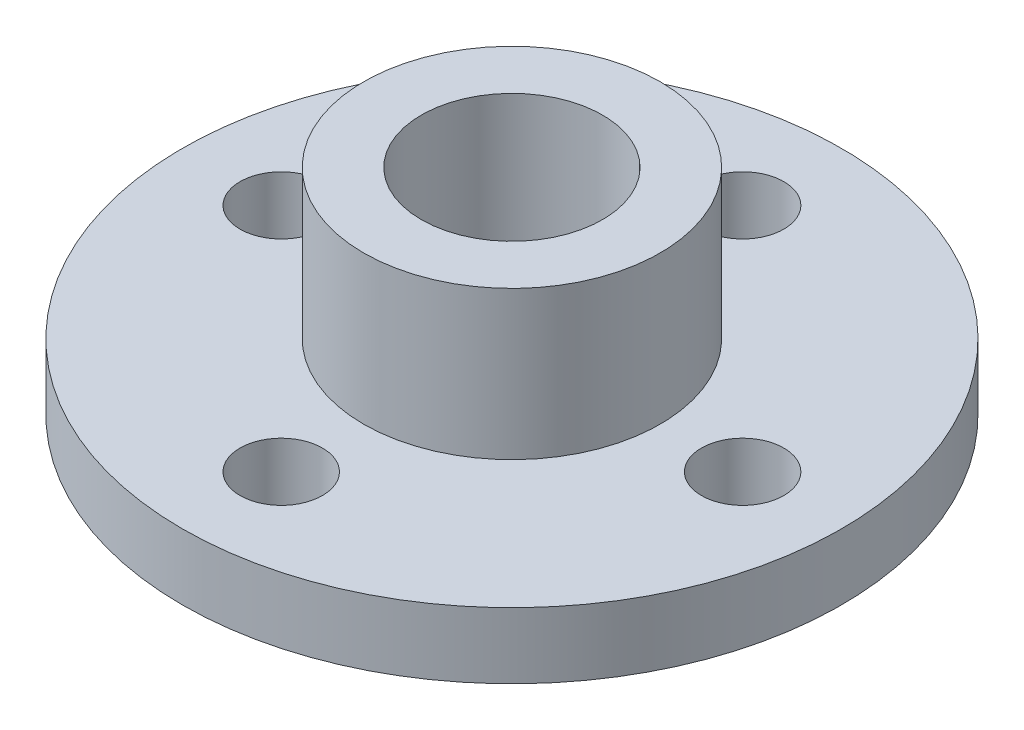
ISO-10303-21;
HEADER;
FILE_DESCRIPTION(('STEP AP214'),'2;1');
FILE_NAME('part.step','',(''),(''),'','','');
FILE_SCHEMA(('AUTOMOTIVE_DESIGN { 1 0 10303 214 1 1 1 1 }'));
ENDSEC;
DATA;
#1=APPLICATION_CONTEXT('core data for automotive mechanical design processes');
#2=APPLICATION_PROTOCOL_DEFINITION('international standard','automotive_design',2000,#1);
#3=PRODUCT_CONTEXT('',#1,'mechanical');
#4=PRODUCT('Part','Part','',(#3));
#5=PRODUCT_RELATED_PRODUCT_CATEGORY('part','',(#4));
#6=PRODUCT_DEFINITION_FORMATION('','',#4);
#7=PRODUCT_DEFINITION_CONTEXT('part definition',#1,'design');
#8=PRODUCT_DEFINITION('design','',#6,#7);
#9=PRODUCT_DEFINITION_SHAPE('','',#8);
#10=(LENGTH_UNIT() NAMED_UNIT(*) SI_UNIT(.MILLI.,.METRE.));
#11=(NAMED_UNIT(*) PLANE_ANGLE_UNIT() SI_UNIT($,.RADIAN.));
#12=(NAMED_UNIT(*) SI_UNIT($,.STERADIAN.) SOLID_ANGLE_UNIT());
#13=UNCERTAINTY_MEASURE_WITH_UNIT(LENGTH_MEASURE(1.E-05),#10,'distance_accuracy_value','');
#14=(GEOMETRIC_REPRESENTATION_CONTEXT(3) GLOBAL_UNCERTAINTY_ASSIGNED_CONTEXT((#13)) GLOBAL_UNIT_ASSIGNED_CONTEXT((#10,
#11,#12)) REPRESENTATION_CONTEXT('',''));
#15=CARTESIAN_POINT('',(0.,0.,0.));
#16=DIRECTION('',(0.,0.,1.));
#17=DIRECTION('',(1.,0.,0.));
#18=AXIS2_PLACEMENT_3D('',#15,#16,#17);
#19=CARTESIAN_POINT('',(0.,-2.,0.));
#20=DIRECTION('',(0.,1.,0.));
#21=DIRECTION('',(0.,0.,1.));
#22=AXIS2_PLACEMENT_3D('',#19,#20,#21);
#23=CYLINDRICAL_SURFACE('',#22,10.);
#24=CARTESIAN_POINT('',(0.,-2.,0.));
#25=DIRECTION('',(0.,1.,0.));
#26=DIRECTION('',(0.,0.,1.));
#27=AXIS2_PLACEMENT_3D('',#24,#25,#26);
#28=CIRCLE('',#27,10.);
#29=CARTESIAN_POINT('',(0.,-2.,10.));
#30=VERTEX_POINT('',#29);
#31=EDGE_CURVE('E50',#30,#30,#28,.T.);
#32=ORIENTED_EDGE('',*,*,#31,.T.);
#33=EDGE_LOOP('',(#32));
#34=FACE_BOUND('',#33,.T.);
#35=CARTESIAN_POINT('',(0.,0.,0.));
#36=DIRECTION('',(0.,1.,0.));
#37=DIRECTION('',(0.,0.,1.));
#38=AXIS2_PLACEMENT_3D('',#35,#36,#37);
#39=CIRCLE('',#38,10.);
#40=CARTESIAN_POINT('',(0.,0.,10.));
#41=VERTEX_POINT('',#40);
#42=EDGE_CURVE('E55',#41,#41,#39,.T.);
#43=ORIENTED_EDGE('',*,*,#42,.F.);
#44=EDGE_LOOP('',(#43));
#45=FACE_BOUND('',#44,.T.);
#46=ADVANCED_FACE('F43',(#34,#45),#23,.T.);
#47=CARTESIAN_POINT('',(0.,-2.,0.));
#48=DIRECTION('',(0.,1.,0.));
#49=DIRECTION('',(0.,0.,1.));
#50=AXIS2_PLACEMENT_3D('',#47,#48,#49);
#51=PLANE('',#50);
#52=CARTESIAN_POINT('',(-7.,-2.,0.));
#53=DIRECTION('',(0.,1.,0.));
#54=DIRECTION('',(0.,0.,1.));
#55=AXIS2_PLACEMENT_3D('',#52,#53,#54);
#56=CIRCLE('',#55,1.25);
#57=CARTESIAN_POINT('',(-7.,-2.,1.24999999999992));
#58=VERTEX_POINT('',#57);
#59=EDGE_CURVE('E98',#58,#58,#56,.T.);
#60=ORIENTED_EDGE('',*,*,#59,.T.);
#61=EDGE_LOOP('',(#60));
#62=FACE_BOUND('',#61,.T.);
#63=CARTESIAN_POINT('',(0.,-2.,7.));
#64=DIRECTION('',(0.,1.,0.));
#65=DIRECTION('',(0.,0.,1.));
#66=AXIS2_PLACEMENT_3D('',#63,#64,#65);
#67=CIRCLE('',#66,1.25);
#68=CARTESIAN_POINT('',(0.,-2.,8.25));
#69=VERTEX_POINT('',#68);
#70=EDGE_CURVE('E90',#69,#69,#67,.T.);
#71=ORIENTED_EDGE('',*,*,#70,.T.);
#72=EDGE_LOOP('',(#71));
#73=FACE_BOUND('',#72,.T.);
#74=CARTESIAN_POINT('',(7.,-2.,0.));
#75=DIRECTION('',(0.,1.,0.));
#76=DIRECTION('',(0.,0.,1.));
#77=AXIS2_PLACEMENT_3D('',#74,#75,#76);
#78=CIRCLE('',#77,1.25);
#79=CARTESIAN_POINT('',(7.,-2.,1.25000000000002));
#80=VERTEX_POINT('',#79);
#81=EDGE_CURVE('E82',#80,#80,#78,.T.);
#82=ORIENTED_EDGE('',*,*,#81,.T.);
#83=EDGE_LOOP('',(#82));
#84=FACE_BOUND('',#83,.T.);
#85=CARTESIAN_POINT('',(0.,-2.,-7.));
#86=DIRECTION('',(0.,1.,0.));
#87=DIRECTION('',(0.,0.,1.));
#88=AXIS2_PLACEMENT_3D('',#85,#86,#87);
#89=CIRCLE('',#88,1.25);
#90=CARTESIAN_POINT('',(0.,-2.,-5.75));
#91=VERTEX_POINT('',#90);
#92=EDGE_CURVE('E68',#91,#91,#89,.T.);
#93=ORIENTED_EDGE('',*,*,#92,.T.);
#94=EDGE_LOOP('',(#93));
#95=FACE_BOUND('',#94,.T.);
#96=ORIENTED_EDGE('',*,*,#31,.F.);
#97=EDGE_LOOP('',(#96));
#98=FACE_BOUND('',#97,.T.);
#99=ADVANCED_FACE('F114',(#62,#73,#84,#95,#98),#51,.F.);
#100=CARTESIAN_POINT('',(0.,0.,0.));
#101=DIRECTION('',(0.,1.,0.));
#102=DIRECTION('',(0.,0.,1.));
#103=AXIS2_PLACEMENT_3D('',#100,#101,#102);
#104=PLANE('',#103);
#105=CARTESIAN_POINT('',(-7.,0.,0.));
#106=DIRECTION('',(0.,1.,0.));
#107=DIRECTION('',(0.,0.,1.));
#108=AXIS2_PLACEMENT_3D('',#105,#106,#107);
#109=CIRCLE('',#108,1.25);
#110=CARTESIAN_POINT('',(-7.,0.,1.24999999999993));
#111=VERTEX_POINT('',#110);
#112=EDGE_CURVE('E102',#111,#111,#109,.T.);
#113=ORIENTED_EDGE('',*,*,#112,.F.);
#114=EDGE_LOOP('',(#113));
#115=FACE_BOUND('',#114,.T.);
#116=CARTESIAN_POINT('',(0.,0.,7.));
#117=DIRECTION('',(0.,1.,0.));
#118=DIRECTION('',(0.,0.,1.));
#119=AXIS2_PLACEMENT_3D('',#116,#117,#118);
#120=CIRCLE('',#119,1.25);
#121=CARTESIAN_POINT('',(0.,0.,8.25));
#122=VERTEX_POINT('',#121);
#123=EDGE_CURVE('E94',#122,#122,#120,.T.);
#124=ORIENTED_EDGE('',*,*,#123,.F.);
#125=EDGE_LOOP('',(#124));
#126=FACE_BOUND('',#125,.T.);
#127=CARTESIAN_POINT('',(7.,0.,0.));
#128=DIRECTION('',(0.,1.,0.));
#129=DIRECTION('',(0.,0.,1.));
#130=AXIS2_PLACEMENT_3D('',#127,#128,#129);
#131=CIRCLE('',#130,1.25);
#132=CARTESIAN_POINT('',(7.,0.,1.25000000000002));
#133=VERTEX_POINT('',#132);
#134=EDGE_CURVE('E86',#133,#133,#131,.T.);
#135=ORIENTED_EDGE('',*,*,#134,.F.);
#136=EDGE_LOOP('',(#135));
#137=FACE_BOUND('',#136,.T.);
#138=CARTESIAN_POINT('',(0.,0.,-7.));
#139=DIRECTION('',(0.,1.,0.));
#140=DIRECTION('',(0.,0.,1.));
#141=AXIS2_PLACEMENT_3D('',#138,#139,#140);
#142=CIRCLE('',#141,1.25);
#143=CARTESIAN_POINT('',(0.,0.,-5.75));
#144=VERTEX_POINT('',#143);
#145=EDGE_CURVE('E78',#144,#144,#142,.T.);
#146=ORIENTED_EDGE('',*,*,#145,.F.);
#147=EDGE_LOOP('',(#146));
#148=FACE_BOUND('',#147,.T.);
#149=CARTESIAN_POINT('',(0.,0.,0.));
#150=DIRECTION('',(0.,1.,0.));
#151=DIRECTION('',(0.,0.,1.));
#152=AXIS2_PLACEMENT_3D('',#149,#150,#151);
#153=CIRCLE('',#152,4.5);
#154=CARTESIAN_POINT('',(0.,0.,4.5));
#155=VERTEX_POINT('',#154);
#156=EDGE_CURVE('E63',#155,#155,#153,.T.);
#157=ORIENTED_EDGE('',*,*,#156,.F.);
#158=EDGE_LOOP('',(#157));
#159=FACE_BOUND('',#158,.T.);
#160=ORIENTED_EDGE('',*,*,#42,.T.);
#161=EDGE_LOOP('',(#160));
#162=FACE_BOUND('',#161,.T.);
#163=ADVANCED_FACE('F110',(#115,#126,#137,#148,#159,#162),#104,.T.);
#164=CARTESIAN_POINT('',(0.,4.5,0.));
#165=DIRECTION('',(0.,-1.,0.));
#166=DIRECTION('',(0.,0.,-1.));
#167=AXIS2_PLACEMENT_3D('',#164,#165,#166);
#168=CYLINDRICAL_SURFACE('',#167,2.75);
#169=CARTESIAN_POINT('',(0.,4.5,0.));
#170=DIRECTION('',(0.,1.,0.));
#171=DIRECTION('',(0.,0.,1.));
#172=AXIS2_PLACEMENT_3D('',#169,#170,#171);
#173=CIRCLE('',#172,2.75);
#174=CARTESIAN_POINT('',(0.,4.5,2.75));
#175=VERTEX_POINT('',#174);
#176=EDGE_CURVE('E67',#175,#175,#173,.T.);
#177=ORIENTED_EDGE('',*,*,#176,.T.);
#178=EDGE_LOOP('',(#177));
#179=FACE_BOUND('',#178,.T.);
#180=CARTESIAN_POINT('',(0.,0.,0.));
#181=DIRECTION('',(0.,1.,0.));
#182=DIRECTION('',(0.,0.,1.));
#183=AXIS2_PLACEMENT_3D('',#180,#181,#182);
#184=CIRCLE('',#183,2.75);
#185=CARTESIAN_POINT('',(0.,0.,2.75));
#186=VERTEX_POINT('',#185);
#187=EDGE_CURVE('E10',#186,#186,#184,.F.);
#188=ORIENTED_EDGE('',*,*,#187,.T.);
#189=EDGE_LOOP('',(#188));
#190=FACE_BOUND('',#189,.T.);
#191=ADVANCED_FACE('F113',(#179,#190),#168,.F.);
#192=CARTESIAN_POINT('',(0.,4.5,0.));
#193=DIRECTION('',(0.,-1.,0.));
#194=DIRECTION('',(0.,0.,-1.));
#195=AXIS2_PLACEMENT_3D('',#192,#193,#194);
#196=CYLINDRICAL_SURFACE('',#195,4.5);
#197=CARTESIAN_POINT('',(0.,4.5,0.));
#198=DIRECTION('',(0.,1.,0.));
#199=DIRECTION('',(0.,0.,1.));
#200=AXIS2_PLACEMENT_3D('',#197,#198,#199);
#201=CIRCLE('',#200,4.5);
#202=CARTESIAN_POINT('',(0.,4.5,4.5));
#203=VERTEX_POINT('',#202);
#204=EDGE_CURVE('E61',#203,#203,#201,.T.);
#205=ORIENTED_EDGE('',*,*,#204,.F.);
#206=EDGE_LOOP('',(#205));
#207=FACE_BOUND('',#206,.T.);
#208=ORIENTED_EDGE('',*,*,#156,.T.);
#209=EDGE_LOOP('',(#208));
#210=FACE_BOUND('',#209,.T.);
#211=ADVANCED_FACE('F139',(#207,#210),#196,.T.);
#212=CARTESIAN_POINT('',(0.,4.5,0.));
#213=DIRECTION('',(0.,1.,0.));
#214=DIRECTION('',(0.,0.,1.));
#215=AXIS2_PLACEMENT_3D('',#212,#213,#214);
#216=PLANE('',#215);
#217=ORIENTED_EDGE('',*,*,#176,.F.);
#218=EDGE_LOOP('',(#217));
#219=FACE_BOUND('',#218,.T.);
#220=ORIENTED_EDGE('',*,*,#204,.T.);
#221=EDGE_LOOP('',(#220));
#222=FACE_BOUND('',#221,.T.);
#223=ADVANCED_FACE('F143',(#219,#222),#216,.T.);
#224=ORIENTED_EDGE('',*,*,#187,.F.);
#225=EDGE_LOOP('',(#224));
#226=FACE_BOUND('',#225,.T.);
#227=ADVANCED_FACE('F115',(#226),#104,.T.);
#228=CARTESIAN_POINT('',(0.,0.,-7.));
#229=DIRECTION('',(0.,1.,0.));
#230=DIRECTION('',(0.,0.,1.));
#231=AXIS2_PLACEMENT_3D('',#228,#229,#230);
#232=CYLINDRICAL_SURFACE('',#231,1.25);
#233=ORIENTED_EDGE('',*,*,#145,.T.);
#234=EDGE_LOOP('',(#233));
#235=FACE_BOUND('',#234,.T.);
#236=ORIENTED_EDGE('',*,*,#92,.F.);
#237=EDGE_LOOP('',(#236));
#238=FACE_BOUND('',#237,.T.);
#239=ADVANCED_FACE('F148',(#235,#238),#232,.F.);
#240=CARTESIAN_POINT('',(7.,0.,0.));
#241=DIRECTION('',(0.,1.,0.));
#242=DIRECTION('',(0.,0.,1.));
#243=AXIS2_PLACEMENT_3D('',#240,#241,#242);
#244=CYLINDRICAL_SURFACE('',#243,1.25);
#245=ORIENTED_EDGE('',*,*,#134,.T.);
#246=EDGE_LOOP('',(#245));
#247=FACE_BOUND('',#246,.T.);
#248=ORIENTED_EDGE('',*,*,#81,.F.);
#249=EDGE_LOOP('',(#248));
#250=FACE_BOUND('',#249,.T.);
#251=ADVANCED_FACE('F150',(#247,#250),#244,.F.);
#252=CARTESIAN_POINT('',(0.,0.,7.));
#253=DIRECTION('',(0.,1.,0.));
#254=DIRECTION('',(0.,0.,1.));
#255=AXIS2_PLACEMENT_3D('',#252,#253,#254);
#256=CYLINDRICAL_SURFACE('',#255,1.25);
#257=ORIENTED_EDGE('',*,*,#123,.T.);
#258=EDGE_LOOP('',(#257));
#259=FACE_BOUND('',#258,.T.);
#260=ORIENTED_EDGE('',*,*,#70,.F.);
#261=EDGE_LOOP('',(#260));
#262=FACE_BOUND('',#261,.T.);
#263=ADVANCED_FACE('F154',(#259,#262),#256,.F.);
#264=CARTESIAN_POINT('',(-7.,0.,0.));
#265=DIRECTION('',(0.,1.,0.));
#266=DIRECTION('',(0.,0.,1.));
#267=AXIS2_PLACEMENT_3D('',#264,#265,#266);
#268=CYLINDRICAL_SURFACE('',#267,1.25);
#269=ORIENTED_EDGE('',*,*,#112,.T.);
#270=EDGE_LOOP('',(#269));
#271=FACE_BOUND('',#270,.T.);
#272=ORIENTED_EDGE('',*,*,#59,.F.);
#273=EDGE_LOOP('',(#272));
#274=FACE_BOUND('',#273,.T.);
#275=ADVANCED_FACE('F107',(#271,#274),#268,.F.);
#276=CLOSED_SHELL('',(#46,#99,#163,#191,#211,#223,#227,#239,#251,#263,#275));
#277=MANIFOLD_SOLID_BREP('B2',#276);
#278=ADVANCED_BREP_SHAPE_REPRESENTATION('',(#18,#277),#14);
#279=SHAPE_DEFINITION_REPRESENTATION(#9,#278);
ENDSEC;
END-ISO-10303-21;
